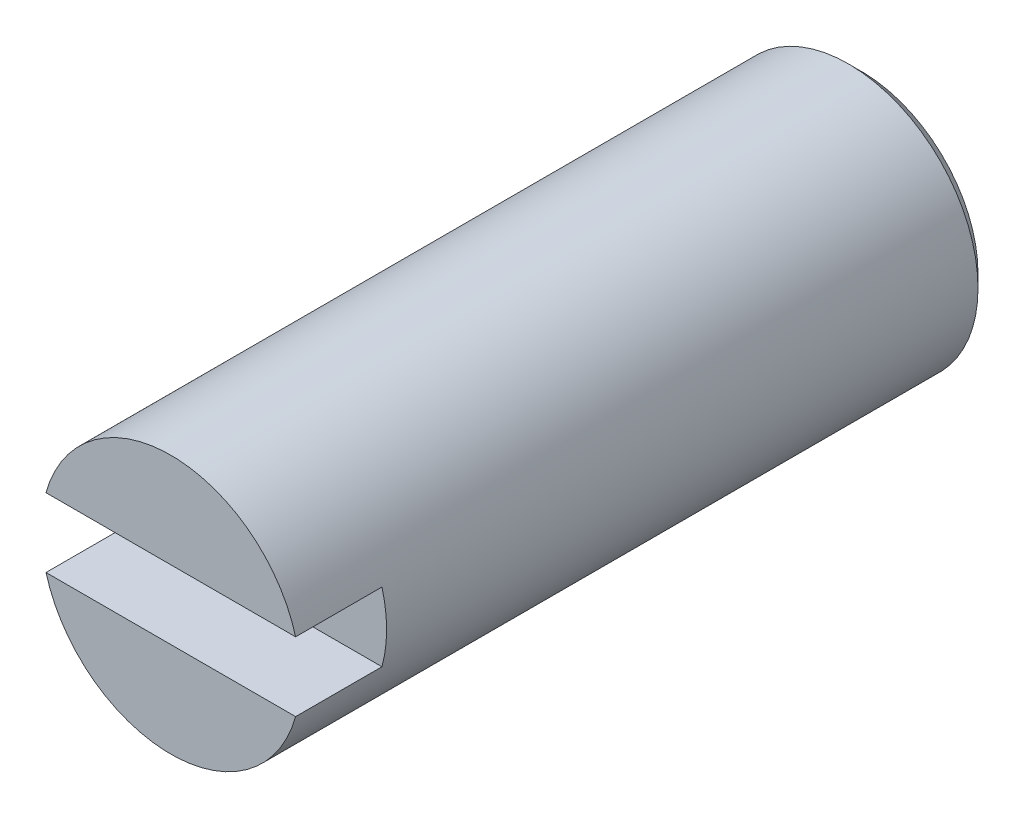
ISO-10303-21;
HEADER;
FILE_DESCRIPTION(('STEP AP214'),'2;1');
FILE_NAME('part.step','',(''),(''),'','','');
FILE_SCHEMA(('AUTOMOTIVE_DESIGN { 1 0 10303 214 1 1 1 1 }'));
ENDSEC;
DATA;
#1=APPLICATION_CONTEXT('core data for automotive mechanical design processes');
#2=APPLICATION_PROTOCOL_DEFINITION('international standard','automotive_design',2000,#1);
#3=PRODUCT_CONTEXT('',#1,'mechanical');
#4=PRODUCT('Part','Part','',(#3));
#5=PRODUCT_RELATED_PRODUCT_CATEGORY('part','',(#4));
#6=PRODUCT_DEFINITION_FORMATION('','',#4);
#7=PRODUCT_DEFINITION_CONTEXT('part definition',#1,'design');
#8=PRODUCT_DEFINITION('design','',#6,#7);
#9=PRODUCT_DEFINITION_SHAPE('','',#8);
#10=(LENGTH_UNIT() NAMED_UNIT(*) SI_UNIT(.MILLI.,.METRE.));
#11=(NAMED_UNIT(*) PLANE_ANGLE_UNIT() SI_UNIT($,.RADIAN.));
#12=(NAMED_UNIT(*) SI_UNIT($,.STERADIAN.) SOLID_ANGLE_UNIT());
#13=UNCERTAINTY_MEASURE_WITH_UNIT(LENGTH_MEASURE(1.E-05),#10,'distance_accuracy_value','');
#14=(GEOMETRIC_REPRESENTATION_CONTEXT(3) GLOBAL_UNCERTAINTY_ASSIGNED_CONTEXT((#13)) GLOBAL_UNIT_ASSIGNED_CONTEXT((#10,
#11,#12)) REPRESENTATION_CONTEXT('',''));
#15=CARTESIAN_POINT('',(0.,0.,0.));
#16=DIRECTION('',(0.,0.,1.));
#17=DIRECTION('',(1.,0.,0.));
#18=AXIS2_PLACEMENT_3D('',#15,#16,#17);
#19=CARTESIAN_POINT('',(0.,0.,4.));
#20=DIRECTION('',(0.,0.,-1.));
#21=DIRECTION('',(-1.,0.,0.));
#22=AXIS2_PLACEMENT_3D('',#19,#20,#21);
#23=CYLINDRICAL_SURFACE('',#22,1.5);
#24=CARTESIAN_POINT('',(0.,0.,-3.85));
#25=DIRECTION('',(0.,0.,1.));
#26=DIRECTION('',(1.,0.,0.));
#27=AXIS2_PLACEMENT_3D('',#24,#25,#26);
#28=CIRCLE('',#27,1.5);
#29=CARTESIAN_POINT('',(1.5,0.,-3.85));
#30=VERTEX_POINT('',#29);
#31=EDGE_CURVE('E89',#30,#30,#28,.T.);
#32=ORIENTED_EDGE('',*,*,#31,.T.);
#33=EDGE_LOOP('',(#32));
#34=FACE_BOUND('',#33,.T.);
#35=DIRECTION('',(0.,0.,-1.));
#36=VECTOR('',#35,1.);
#37=CARTESIAN_POINT('',(-1.4456832294801,-0.4,4.));
#38=LINE('',#37,#36);
#39=CARTESIAN_POINT('',(-1.4456832294801,-0.4,3.));
#40=VERTEX_POINT('',#39);
#41=CARTESIAN_POINT('',(-1.4456832294801,-0.4,4.));
#42=VERTEX_POINT('',#41);
#43=EDGE_CURVE('E108',#40,#42,#38,.F.);
#44=ORIENTED_EDGE('',*,*,#43,.F.);
#45=CARTESIAN_POINT('',(0.,0.,3.));
#46=DIRECTION('',(0.,0.,1.));
#47=DIRECTION('',(1.,0.,0.));
#48=AXIS2_PLACEMENT_3D('',#45,#46,#47);
#49=CIRCLE('',#48,1.5);
#50=CARTESIAN_POINT('',(-1.4456832294801,0.4,3.));
#51=VERTEX_POINT('',#50);
#52=EDGE_CURVE('E11',#51,#40,#49,.T.);
#53=ORIENTED_EDGE('',*,*,#52,.F.);
#54=DIRECTION('',(0.,0.,-1.));
#55=VECTOR('',#54,1.);
#56=CARTESIAN_POINT('',(-1.4456832294801,0.4,4.));
#57=LINE('',#56,#55);
#58=CARTESIAN_POINT('',(-1.4456832294801,0.4,4.));
#59=VERTEX_POINT('',#58);
#60=EDGE_CURVE('E76',#51,#59,#57,.F.);
#61=ORIENTED_EDGE('',*,*,#60,.T.);
#62=CARTESIAN_POINT('',(0.,0.,4.));
#63=DIRECTION('',(0.,0.,1.));
#64=DIRECTION('',(1.,0.,0.));
#65=AXIS2_PLACEMENT_3D('',#62,#63,#64);
#66=CIRCLE('',#65,1.5);
#67=CARTESIAN_POINT('',(1.4456832294801,0.4,4.));
#68=VERTEX_POINT('',#67);
#69=EDGE_CURVE('E85',#68,#59,#66,.T.);
#70=ORIENTED_EDGE('',*,*,#69,.F.);
#71=DIRECTION('',(0.,0.,-1.));
#72=VECTOR('',#71,1.);
#73=CARTESIAN_POINT('',(1.4456832294801,0.4,4.));
#74=LINE('',#73,#72);
#75=CARTESIAN_POINT('',(1.4456832294801,0.4,3.));
#76=VERTEX_POINT('',#75);
#77=EDGE_CURVE('E49',#68,#76,#74,.T.);
#78=ORIENTED_EDGE('',*,*,#77,.T.);
#79=CARTESIAN_POINT('',(1.4456832294801,-0.4,3.));
#80=VERTEX_POINT('',#79);
#81=EDGE_CURVE('E38',#80,#76,#49,.T.);
#82=ORIENTED_EDGE('',*,*,#81,.F.);
#83=DIRECTION('',(0.,0.,-1.));
#84=VECTOR('',#83,1.);
#85=CARTESIAN_POINT('',(1.4456832294801,-0.4,4.));
#86=LINE('',#85,#84);
#87=CARTESIAN_POINT('',(1.4456832294801,-0.4,4.));
#88=VERTEX_POINT('',#87);
#89=EDGE_CURVE('E95',#88,#80,#86,.T.);
#90=ORIENTED_EDGE('',*,*,#89,.F.);
#91=EDGE_CURVE('E90',#42,#88,#66,.T.);
#92=ORIENTED_EDGE('',*,*,#91,.F.);
#93=EDGE_LOOP('',(#44,#53,#61,#70,#78,#82,#90,#92));
#94=FACE_BOUND('',#93,.T.);
#95=ADVANCED_FACE('F34',(#34,#94),#23,.T.);
#96=CARTESIAN_POINT('',(0.,0.,4.));
#97=DIRECTION('',(0.,0.,1.));
#98=DIRECTION('',(1.,0.,0.));
#99=AXIS2_PLACEMENT_3D('',#96,#97,#98);
#100=PLANE('',#99);
#101=ORIENTED_EDGE('',*,*,#91,.T.);
#102=DIRECTION('',(-1.,0.,0.));
#103=VECTOR('',#102,1.);
#104=CARTESIAN_POINT('',(0.,-0.4,4.));
#105=LINE('',#104,#103);
#106=EDGE_CURVE('E80',#88,#42,#105,.T.);
#107=ORIENTED_EDGE('',*,*,#106,.T.);
#108=EDGE_LOOP('',(#101,#107));
#109=FACE_BOUND('',#108,.T.);
#110=ADVANCED_FACE('F113',(#109),#100,.T.);
#111=DIRECTION('',(-1.,0.,0.));
#112=VECTOR('',#111,1.);
#113=CARTESIAN_POINT('',(0.,0.4,4.));
#114=LINE('',#113,#112);
#115=EDGE_CURVE('E73',#68,#59,#114,.T.);
#116=ORIENTED_EDGE('',*,*,#115,.F.);
#117=ORIENTED_EDGE('',*,*,#69,.T.);
#118=EDGE_LOOP('',(#116,#117));
#119=FACE_BOUND('',#118,.T.);
#120=ADVANCED_FACE('F88',(#119),#100,.T.);
#121=CARTESIAN_POINT('',(0.,0.,-4.));
#122=DIRECTION('',(0.,0.,1.));
#123=DIRECTION('',(1.,0.,0.));
#124=AXIS2_PLACEMENT_3D('',#121,#122,#123);
#125=PLANE('',#124);
#126=CARTESIAN_POINT('',(0.,0.,-4.));
#127=DIRECTION('',(0.,0.,1.));
#128=DIRECTION('',(1.,0.,0.));
#129=AXIS2_PLACEMENT_3D('',#126,#127,#128);
#130=CIRCLE('',#129,1.35);
#131=CARTESIAN_POINT('',(1.35,0.,-4.));
#132=VERTEX_POINT('',#131);
#133=EDGE_CURVE('E81',#132,#132,#130,.F.);
#134=ORIENTED_EDGE('',*,*,#133,.T.);
#135=EDGE_LOOP('',(#134));
#136=FACE_BOUND('',#135,.T.);
#137=ADVANCED_FACE('F120',(#136),#125,.F.);
#138=CARTESIAN_POINT('',(0.,0.,-3.85));
#139=DIRECTION('',(0.,0.,1.));
#140=DIRECTION('',(1.,0.,0.));
#141=AXIS2_PLACEMENT_3D('',#138,#139,#140);
#142=CONICAL_SURFACE('',#141,1.5,0.785398163397453);
#143=ORIENTED_EDGE('',*,*,#133,.F.);
#144=EDGE_LOOP('',(#143));
#145=FACE_BOUND('',#144,.T.);
#146=ORIENTED_EDGE('',*,*,#31,.F.);
#147=EDGE_LOOP('',(#146));
#148=FACE_BOUND('',#147,.T.);
#149=ADVANCED_FACE('F36',(#145,#148),#142,.T.);
#150=CARTESIAN_POINT('',(0.,0.,3.));
#151=DIRECTION('',(0.,0.,1.));
#152=DIRECTION('',(1.,0.,0.));
#153=AXIS2_PLACEMENT_3D('',#150,#151,#152);
#154=PLANE('',#153);
#155=DIRECTION('',(-1.,0.,0.));
#156=VECTOR('',#155,1.);
#157=CARTESIAN_POINT('',(1.5,0.4,3.));
#158=LINE('',#157,#156);
#159=EDGE_CURVE('E105',#76,#51,#158,.T.);
#160=ORIENTED_EDGE('',*,*,#159,.T.);
#161=ORIENTED_EDGE('',*,*,#52,.T.);
#162=DIRECTION('',(-1.,0.,0.));
#163=VECTOR('',#162,1.);
#164=CARTESIAN_POINT('',(1.5,-0.4,3.));
#165=LINE('',#164,#163);
#166=EDGE_CURVE('E86',#80,#40,#165,.T.);
#167=ORIENTED_EDGE('',*,*,#166,.F.);
#168=ORIENTED_EDGE('',*,*,#81,.T.);
#169=EDGE_LOOP('',(#160,#161,#167,#168));
#170=FACE_BOUND('',#169,.T.);
#171=ADVANCED_FACE('F104',(#170),#154,.T.);
#172=CARTESIAN_POINT('',(1.5,-0.4,3.));
#173=DIRECTION('',(0.,1.,0.));
#174=DIRECTION('',(0.,0.,1.));
#175=AXIS2_PLACEMENT_3D('',#172,#173,#174);
#176=PLANE('',#175);
#177=ORIENTED_EDGE('',*,*,#89,.T.);
#178=ORIENTED_EDGE('',*,*,#166,.T.);
#179=ORIENTED_EDGE('',*,*,#43,.T.);
#180=ORIENTED_EDGE('',*,*,#106,.F.);
#181=EDGE_LOOP('',(#177,#178,#179,#180));
#182=FACE_BOUND('',#181,.T.);
#183=ADVANCED_FACE('F112',(#182),#176,.T.);
#184=CARTESIAN_POINT('',(1.5,0.4,3.));
#185=DIRECTION('',(0.,1.,0.));
#186=DIRECTION('',(0.,0.,1.));
#187=AXIS2_PLACEMENT_3D('',#184,#185,#186);
#188=PLANE('',#187);
#189=ORIENTED_EDGE('',*,*,#115,.T.);
#190=ORIENTED_EDGE('',*,*,#60,.F.);
#191=ORIENTED_EDGE('',*,*,#159,.F.);
#192=ORIENTED_EDGE('',*,*,#77,.F.);
#193=EDGE_LOOP('',(#189,#190,#191,#192));
#194=FACE_BOUND('',#193,.T.);
#195=ADVANCED_FACE('F75',(#194),#188,.F.);
#196=CLOSED_SHELL('',(#95,#110,#120,#137,#149,#171,#183,#195));
#197=MANIFOLD_SOLID_BREP('B2',#196);
#198=ADVANCED_BREP_SHAPE_REPRESENTATION('',(#18,#197),#14);
#199=SHAPE_DEFINITION_REPRESENTATION(#9,#198);
ENDSEC;
END-ISO-10303-21;
